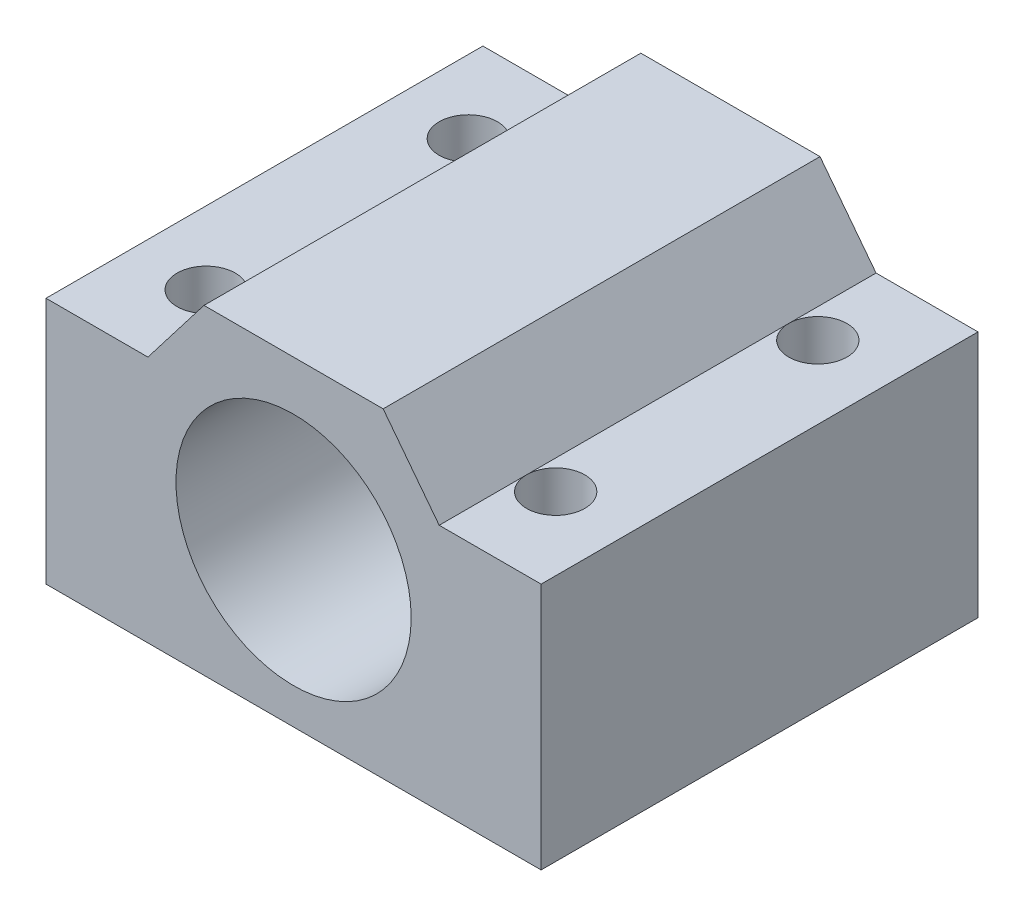
ISO-10303-21;
HEADER;
FILE_DESCRIPTION(('STEP AP214'),'2;1');
FILE_NAME('part.step','',(''),(''),'','','');
FILE_SCHEMA(('AUTOMOTIVE_DESIGN { 1 0 10303 214 1 1 1 1 }'));
ENDSEC;
DATA;
#1=APPLICATION_CONTEXT('core data for automotive mechanical design processes');
#2=APPLICATION_PROTOCOL_DEFINITION('international standard','automotive_design',2000,#1);
#3=PRODUCT_CONTEXT('',#1,'mechanical');
#4=PRODUCT('Part','Part','',(#3));
#5=PRODUCT_RELATED_PRODUCT_CATEGORY('part','',(#4));
#6=PRODUCT_DEFINITION_FORMATION('','',#4);
#7=PRODUCT_DEFINITION_CONTEXT('part definition',#1,'design');
#8=PRODUCT_DEFINITION('design','',#6,#7);
#9=PRODUCT_DEFINITION_SHAPE('','',#8);
#10=(LENGTH_UNIT() NAMED_UNIT(*) SI_UNIT(.MILLI.,.METRE.));
#11=(NAMED_UNIT(*) PLANE_ANGLE_UNIT() SI_UNIT($,.RADIAN.));
#12=(NAMED_UNIT(*) SI_UNIT($,.STERADIAN.) SOLID_ANGLE_UNIT());
#13=UNCERTAINTY_MEASURE_WITH_UNIT(LENGTH_MEASURE(1.E-05),#10,'distance_accuracy_value','');
#14=(GEOMETRIC_REPRESENTATION_CONTEXT(3) GLOBAL_UNCERTAINTY_ASSIGNED_CONTEXT((#13)) GLOBAL_UNIT_ASSIGNED_CONTEXT((#10,
#11,#12)) REPRESENTATION_CONTEXT('',''));
#15=CARTESIAN_POINT('',(0.,0.,0.));
#16=DIRECTION('',(0.,0.,1.));
#17=DIRECTION('',(1.,0.,0.));
#18=AXIS2_PLACEMENT_3D('',#15,#16,#17);
#19=CARTESIAN_POINT('',(0.,17.,0.));
#20=DIRECTION('',(0.,1.,0.));
#21=DIRECTION('',(0.,0.,1.));
#22=AXIS2_PLACEMENT_3D('',#19,#20,#21);
#23=PLANE('',#22);
#24=DIRECTION('',(-1.,0.,0.));
#25=VECTOR('',#24,1.);
#26=CARTESIAN_POINT('',(-15.7742946708464,17.,-17.9561128526646));
#27=LINE('',#26,#25);
#28=CARTESIAN_POINT('',(18.2257053291536,17.,-17.9561128526646));
#29=VERTEX_POINT('',#28);
#30=CARTESIAN_POINT('',(11.2257053291536,17.,-17.9561128526646));
#31=VERTEX_POINT('',#30);
#32=EDGE_CURVE('E195',#29,#31,#27,.T.);
#33=ORIENTED_EDGE('',*,*,#32,.T.);
#34=DIRECTION('',(0.,0.,1.));
#35=VECTOR('',#34,1.);
#36=CARTESIAN_POINT('',(11.2257053291536,17.,-38.5716409807529));
#37=LINE('',#36,#35);
#38=CARTESIAN_POINT('',(11.2257053291536,17.,-11.9561128526646));
#39=VERTEX_POINT('',#38);
#40=EDGE_CURVE('E135',#31,#39,#37,.T.);
#41=ORIENTED_EDGE('',*,*,#40,.T.);
#42=CARTESIAN_POINT('',(13.2257053291536,17.,-11.9561128526646));
#43=DIRECTION('',(0.,1.,0.));
#44=DIRECTION('',(0.,0.,-1.));
#45=AXIS2_PLACEMENT_3D('',#42,#43,#44);
#46=CIRCLE('',#45,2.);
#47=EDGE_CURVE('E178',#39,#39,#46,.T.);
#48=ORIENTED_EDGE('',*,*,#47,.F.);
#49=CARTESIAN_POINT('',(11.2257053291536,17.,6.04388714733542));
#50=VERTEX_POINT('',#49);
#51=EDGE_CURVE('E162',#39,#50,#37,.T.);
#52=ORIENTED_EDGE('',*,*,#51,.T.);
#53=CARTESIAN_POINT('',(13.2257053291536,17.,6.04388714733543));
#54=DIRECTION('',(0.,1.,0.));
#55=DIRECTION('',(0.,0.,1.));
#56=AXIS2_PLACEMENT_3D('',#53,#54,#55);
#57=CIRCLE('',#56,2.);
#58=EDGE_CURVE('E172',#50,#50,#57,.T.);
#59=ORIENTED_EDGE('',*,*,#58,.F.);
#60=CARTESIAN_POINT('',(11.2257053291536,17.,12.0438871473354));
#61=VERTEX_POINT('',#60);
#62=EDGE_CURVE('E163',#50,#61,#37,.T.);
#63=ORIENTED_EDGE('',*,*,#62,.T.);
#64=DIRECTION('',(1.,0.,0.));
#65=VECTOR('',#64,1.);
#66=CARTESIAN_POINT('',(-15.7742946708464,17.,12.0438871473354));
#67=LINE('',#66,#65);
#68=CARTESIAN_POINT('',(18.2257053291536,17.,12.0438871473354));
#69=VERTEX_POINT('',#68);
#70=EDGE_CURVE('E147',#61,#69,#67,.T.);
#71=ORIENTED_EDGE('',*,*,#70,.T.);
#72=DIRECTION('',(0.,0.,-1.));
#73=VECTOR('',#72,1.);
#74=CARTESIAN_POINT('',(18.2257053291536,17.,-17.9561128526646));
#75=LINE('',#74,#73);
#76=EDGE_CURVE('E193',#69,#29,#75,.T.);
#77=ORIENTED_EDGE('',*,*,#76,.T.);
#78=EDGE_LOOP('',(#33,#41,#48,#52,#59,#63,#71,#77));
#79=FACE_BOUND('',#78,.T.);
#80=ADVANCED_FACE('F37',(#79),#23,.T.);
#81=DIRECTION('',(0.,0.,1.));
#82=VECTOR('',#81,1.);
#83=CARTESIAN_POINT('',(-8.7742946708464,17.,-38.5716409807529));
#84=LINE('',#83,#82);
#85=CARTESIAN_POINT('',(-8.77429467084641,17.,-17.9561128526646));
#86=VERTEX_POINT('',#85);
#87=CARTESIAN_POINT('',(-8.7742946708464,17.,-11.9561128526646));
#88=VERTEX_POINT('',#87);
#89=EDGE_CURVE('E48',#86,#88,#84,.T.);
#90=ORIENTED_EDGE('',*,*,#89,.F.);
#91=CARTESIAN_POINT('',(-15.7742946708464,17.,-17.9561128526646));
#92=VERTEX_POINT('',#91);
#93=EDGE_CURVE('E64',#86,#92,#27,.T.);
#94=ORIENTED_EDGE('',*,*,#93,.T.);
#95=DIRECTION('',(0.,0.,1.));
#96=VECTOR('',#95,1.);
#97=CARTESIAN_POINT('',(-15.7742946708464,17.,-17.9561128526646));
#98=LINE('',#97,#96);
#99=CARTESIAN_POINT('',(-15.7742946708464,17.,12.0438871473354));
#100=VERTEX_POINT('',#99);
#101=EDGE_CURVE('E190',#92,#100,#98,.T.);
#102=ORIENTED_EDGE('',*,*,#101,.T.);
#103=CARTESIAN_POINT('',(-8.7742946708464,17.,12.0438871473354));
#104=VERTEX_POINT('',#103);
#105=EDGE_CURVE('E94',#100,#104,#67,.T.);
#106=ORIENTED_EDGE('',*,*,#105,.T.);
#107=CARTESIAN_POINT('',(-8.7742946708464,17.,6.04388714733542));
#108=VERTEX_POINT('',#107);
#109=EDGE_CURVE('E46',#108,#104,#84,.T.);
#110=ORIENTED_EDGE('',*,*,#109,.F.);
#111=CARTESIAN_POINT('',(-10.7742946708464,17.,6.04388714733543));
#112=DIRECTION('',(0.,1.,0.));
#113=DIRECTION('',(0.,0.,-1.));
#114=AXIS2_PLACEMENT_3D('',#111,#112,#113);
#115=CIRCLE('',#114,2.);
#116=EDGE_CURVE('E166',#108,#108,#115,.T.);
#117=ORIENTED_EDGE('',*,*,#116,.F.);
#118=EDGE_CURVE('E11',#88,#108,#84,.T.);
#119=ORIENTED_EDGE('',*,*,#118,.F.);
#120=CARTESIAN_POINT('',(-10.7742946708464,17.,-11.9561128526646));
#121=DIRECTION('',(0.,1.,0.));
#122=DIRECTION('',(0.,0.,1.));
#123=AXIS2_PLACEMENT_3D('',#120,#121,#122);
#124=CIRCLE('',#123,2.);
#125=EDGE_CURVE('E184',#88,#88,#124,.T.);
#126=ORIENTED_EDGE('',*,*,#125,.F.);
#127=EDGE_LOOP('',(#90,#94,#102,#106,#110,#117,#119,#126));
#128=FACE_BOUND('',#127,.T.);
#129=ADVANCED_FACE('F223',(#128),#23,.T.);
#130=CARTESIAN_POINT('',(0.,0.,0.));
#131=DIRECTION('',(0.,1.,0.));
#132=DIRECTION('',(0.,0.,1.));
#133=AXIS2_PLACEMENT_3D('',#130,#131,#132);
#134=PLANE('',#133);
#135=DIRECTION('',(0.,0.,1.));
#136=VECTOR('',#135,1.);
#137=CARTESIAN_POINT('',(-15.7742946708464,0.,-17.9561128526646));
#138=LINE('',#137,#136);
#139=CARTESIAN_POINT('',(-15.7742946708464,0.,-17.9561128526646));
#140=VERTEX_POINT('',#139);
#141=CARTESIAN_POINT('',(-15.7742946708464,0.,12.0438871473354));
#142=VERTEX_POINT('',#141);
#143=EDGE_CURVE('E187',#140,#142,#138,.T.);
#144=ORIENTED_EDGE('',*,*,#143,.F.);
#145=DIRECTION('',(-1.,0.,0.));
#146=VECTOR('',#145,1.);
#147=CARTESIAN_POINT('',(-15.7742946708464,0.,-17.9561128526646));
#148=LINE('',#147,#146);
#149=CARTESIAN_POINT('',(18.2257053291536,0.,-17.9561128526646));
#150=VERTEX_POINT('',#149);
#151=EDGE_CURVE('E86',#150,#140,#148,.T.);
#152=ORIENTED_EDGE('',*,*,#151,.F.);
#153=DIRECTION('',(0.,0.,-1.));
#154=VECTOR('',#153,1.);
#155=CARTESIAN_POINT('',(18.2257053291536,0.,-17.9561128526646));
#156=LINE('',#155,#154);
#157=CARTESIAN_POINT('',(18.2257053291536,0.,12.0438871473354));
#158=VERTEX_POINT('',#157);
#159=EDGE_CURVE('E203',#158,#150,#156,.T.);
#160=ORIENTED_EDGE('',*,*,#159,.F.);
#161=DIRECTION('',(1.,0.,0.));
#162=VECTOR('',#161,1.);
#163=CARTESIAN_POINT('',(-15.7742946708464,0.,12.0438871473354));
#164=LINE('',#163,#162);
#165=EDGE_CURVE('E201',#142,#158,#164,.T.);
#166=ORIENTED_EDGE('',*,*,#165,.F.);
#167=EDGE_LOOP('',(#144,#152,#160,#166));
#168=FACE_BOUND('',#167,.T.);
#169=CARTESIAN_POINT('',(-10.7742946708464,0.,-11.9561128526646));
#170=DIRECTION('',(0.,1.,0.));
#171=DIRECTION('',(0.,0.,1.));
#172=AXIS2_PLACEMENT_3D('',#169,#170,#171);
#173=CIRCLE('',#172,2.);
#174=CARTESIAN_POINT('',(-10.7742946708464,0.,-9.95611285266457));
#175=VERTEX_POINT('',#174);
#176=EDGE_CURVE('E181',#175,#175,#173,.T.);
#177=ORIENTED_EDGE('',*,*,#176,.T.);
#178=EDGE_LOOP('',(#177));
#179=FACE_BOUND('',#178,.T.);
#180=CARTESIAN_POINT('',(13.2257053291536,0.,-11.9561128526646));
#181=DIRECTION('',(0.,1.,0.));
#182=DIRECTION('',(0.,0.,-1.));
#183=AXIS2_PLACEMENT_3D('',#180,#181,#182);
#184=CIRCLE('',#183,2.);
#185=CARTESIAN_POINT('',(13.2257053291536,0.,-13.9561128526646));
#186=VERTEX_POINT('',#185);
#187=EDGE_CURVE('E175',#186,#186,#184,.T.);
#188=ORIENTED_EDGE('',*,*,#187,.T.);
#189=EDGE_LOOP('',(#188));
#190=FACE_BOUND('',#189,.T.);
#191=CARTESIAN_POINT('',(13.2257053291536,0.,6.04388714733543));
#192=DIRECTION('',(0.,1.,0.));
#193=DIRECTION('',(0.,0.,1.));
#194=AXIS2_PLACEMENT_3D('',#191,#192,#193);
#195=CIRCLE('',#194,2.);
#196=CARTESIAN_POINT('',(13.2257053291536,0.,8.04388714733543));
#197=VERTEX_POINT('',#196);
#198=EDGE_CURVE('E169',#197,#197,#195,.T.);
#199=ORIENTED_EDGE('',*,*,#198,.T.);
#200=EDGE_LOOP('',(#199));
#201=FACE_BOUND('',#200,.T.);
#202=CARTESIAN_POINT('',(-10.7742946708464,0.,6.04388714733543));
#203=DIRECTION('',(0.,1.,0.));
#204=DIRECTION('',(0.,0.,-1.));
#205=AXIS2_PLACEMENT_3D('',#202,#203,#204);
#206=CIRCLE('',#205,2.);
#207=CARTESIAN_POINT('',(-10.7742946708464,0.,4.04388714733543));
#208=VERTEX_POINT('',#207);
#209=EDGE_CURVE('E165',#208,#208,#206,.T.);
#210=ORIENTED_EDGE('',*,*,#209,.T.);
#211=EDGE_LOOP('',(#210));
#212=FACE_BOUND('',#211,.T.);
#213=ADVANCED_FACE('F228',(#168,#179,#190,#201,#212),#134,.F.);
#214=CARTESIAN_POINT('',(-15.7742946708464,17.,-17.9561128526646));
#215=DIRECTION('',(1.,0.,0.));
#216=DIRECTION('',(0.,0.,-1.));
#217=AXIS2_PLACEMENT_3D('',#214,#215,#216);
#218=PLANE('',#217);
#219=ORIENTED_EDGE('',*,*,#143,.T.);
#220=DIRECTION('',(0.,-1.,0.));
#221=VECTOR('',#220,1.);
#222=CARTESIAN_POINT('',(-15.7742946708464,17.,12.0438871473354));
#223=LINE('',#222,#221);
#224=EDGE_CURVE('E41',#100,#142,#223,.T.);
#225=ORIENTED_EDGE('',*,*,#224,.F.);
#226=ORIENTED_EDGE('',*,*,#101,.F.);
#227=DIRECTION('',(0.,-1.,0.));
#228=VECTOR('',#227,1.);
#229=CARTESIAN_POINT('',(-15.7742946708464,17.,-17.9561128526646));
#230=LINE('',#229,#228);
#231=EDGE_CURVE('E198',#92,#140,#230,.T.);
#232=ORIENTED_EDGE('',*,*,#231,.T.);
#233=EDGE_LOOP('',(#219,#225,#226,#232));
#234=FACE_BOUND('',#233,.T.);
#235=ADVANCED_FACE('F39',(#234),#218,.F.);
#236=CARTESIAN_POINT('',(-15.7742946708464,17.,12.0438871473354));
#237=DIRECTION('',(0.,0.,-1.));
#238=DIRECTION('',(-1.,0.,0.));
#239=AXIS2_PLACEMENT_3D('',#236,#237,#238);
#240=PLANE('',#239);
#241=CARTESIAN_POINT('',(1.22570532915359,10.534716584043,12.0438871473354));
#242=DIRECTION('',(0.,0.,1.));
#243=DIRECTION('',(1.,0.,0.));
#244=AXIS2_PLACEMENT_3D('',#241,#242,#243);
#245=CIRCLE('',#244,8.07551033040824);
#246=CARTESIAN_POINT('',(9.30121565956183,10.534716584043,12.0438871473354));
#247=VERTEX_POINT('',#246);
#248=EDGE_CURVE('E151',#247,#247,#245,.T.);
#249=ORIENTED_EDGE('',*,*,#248,.F.);
#250=EDGE_LOOP('',(#249));
#251=FACE_BOUND('',#250,.T.);
#252=ORIENTED_EDGE('',*,*,#165,.T.);
#253=DIRECTION('',(0.,-1.,0.));
#254=VECTOR('',#253,1.);
#255=CARTESIAN_POINT('',(18.2257053291536,17.,12.0438871473354));
#256=LINE('',#255,#254);
#257=EDGE_CURVE('E208',#69,#158,#256,.T.);
#258=ORIENTED_EDGE('',*,*,#257,.F.);
#259=ORIENTED_EDGE('',*,*,#70,.F.);
#260=DIRECTION('',(-0.609888573883195,0.792487178096102,0.));
#261=VECTOR('',#260,1.);
#262=CARTESIAN_POINT('',(15.2667371304243,11.7490967597649,12.0438871473354));
#263=LINE('',#262,#261);
#264=CARTESIAN_POINT('',(7.37776563536315,22.,12.0438871473354));
#265=VERTEX_POINT('',#264);
#266=EDGE_CURVE('E55',#61,#265,#263,.T.);
#267=ORIENTED_EDGE('',*,*,#266,.T.);
#268=DIRECTION('',(1.,0.,0.));
#269=VECTOR('',#268,1.);
#270=CARTESIAN_POINT('',(0.,22.,12.0438871473354));
#271=LINE('',#270,#269);
#272=CARTESIAN_POINT('',(-4.92635497705596,22.,12.0438871473354));
#273=VERTEX_POINT('',#272);
#274=EDGE_CURVE('E138',#273,#265,#271,.T.);
#275=ORIENTED_EDGE('',*,*,#274,.F.);
#276=DIRECTION('',(0.609888573883195,0.792487178096102,0.));
#277=VECTOR('',#276,1.);
#278=CARTESIAN_POINT('',(-13.7271631640816,10.5642592044415,12.0438871473354));
#279=LINE('',#278,#277);
#280=EDGE_CURVE('E142',#104,#273,#279,.T.);
#281=ORIENTED_EDGE('',*,*,#280,.F.);
#282=ORIENTED_EDGE('',*,*,#105,.F.);
#283=ORIENTED_EDGE('',*,*,#224,.T.);
#284=EDGE_LOOP('',(#252,#258,#259,#267,#275,#281,#282,#283));
#285=FACE_BOUND('',#284,.T.);
#286=ADVANCED_FACE('F145',(#251,#285),#240,.F.);
#287=CARTESIAN_POINT('',(18.2257053291536,17.,-17.9561128526646));
#288=DIRECTION('',(-1.,0.,0.));
#289=DIRECTION('',(0.,0.,1.));
#290=AXIS2_PLACEMENT_3D('',#287,#288,#289);
#291=PLANE('',#290);
#292=ORIENTED_EDGE('',*,*,#159,.T.);
#293=DIRECTION('',(0.,-1.,0.));
#294=VECTOR('',#293,1.);
#295=CARTESIAN_POINT('',(18.2257053291536,17.,-17.9561128526646));
#296=LINE('',#295,#294);
#297=EDGE_CURVE('E207',#29,#150,#296,.T.);
#298=ORIENTED_EDGE('',*,*,#297,.F.);
#299=ORIENTED_EDGE('',*,*,#76,.F.);
#300=ORIENTED_EDGE('',*,*,#257,.T.);
#301=EDGE_LOOP('',(#292,#298,#299,#300));
#302=FACE_BOUND('',#301,.T.);
#303=ADVANCED_FACE('F231',(#302),#291,.F.);
#304=CARTESIAN_POINT('',(-15.7742946708464,17.,-17.9561128526646));
#305=DIRECTION('',(0.,0.,1.));
#306=DIRECTION('',(1.,0.,0.));
#307=AXIS2_PLACEMENT_3D('',#304,#305,#306);
#308=PLANE('',#307);
#309=CARTESIAN_POINT('',(1.22570532915359,10.534716584043,-17.9561128526646));
#310=DIRECTION('',(0.,0.,1.));
#311=DIRECTION('',(1.,0.,0.));
#312=AXIS2_PLACEMENT_3D('',#309,#310,#311);
#313=CIRCLE('',#312,8.07551033040824);
#314=CARTESIAN_POINT('',(9.30121565956183,10.534716584043,-17.9561128526646));
#315=VERTEX_POINT('',#314);
#316=EDGE_CURVE('E148',#315,#315,#313,.F.);
#317=ORIENTED_EDGE('',*,*,#316,.F.);
#318=EDGE_LOOP('',(#317));
#319=FACE_BOUND('',#318,.T.);
#320=ORIENTED_EDGE('',*,*,#151,.T.);
#321=ORIENTED_EDGE('',*,*,#231,.F.);
#322=ORIENTED_EDGE('',*,*,#93,.F.);
#323=DIRECTION('',(-0.609888573883195,-0.792487178096102,0.));
#324=VECTOR('',#323,1.);
#325=CARTESIAN_POINT('',(-13.7271631640816,10.5642592044415,-17.9561128526646));
#326=LINE('',#325,#324);
#327=CARTESIAN_POINT('',(-4.92635497705596,22.,-17.9561128526646));
#328=VERTEX_POINT('',#327);
#329=EDGE_CURVE('E154',#328,#86,#326,.T.);
#330=ORIENTED_EDGE('',*,*,#329,.F.);
#331=DIRECTION('',(-1.,0.,0.));
#332=VECTOR('',#331,1.);
#333=CARTESIAN_POINT('',(0.,22.,-17.9561128526646));
#334=LINE('',#333,#332);
#335=CARTESIAN_POINT('',(7.37776563536315,22.,-17.9561128526646));
#336=VERTEX_POINT('',#335);
#337=EDGE_CURVE('E158',#336,#328,#334,.T.);
#338=ORIENTED_EDGE('',*,*,#337,.F.);
#339=DIRECTION('',(0.609888573883195,-0.792487178096102,0.));
#340=VECTOR('',#339,1.);
#341=CARTESIAN_POINT('',(15.2667371304243,11.7490967597649,-17.9561128526646));
#342=LINE('',#341,#340);
#343=EDGE_CURVE('E131',#336,#31,#342,.T.);
#344=ORIENTED_EDGE('',*,*,#343,.T.);
#345=ORIENTED_EDGE('',*,*,#32,.F.);
#346=ORIENTED_EDGE('',*,*,#297,.T.);
#347=EDGE_LOOP('',(#320,#321,#322,#330,#338,#344,#345,#346));
#348=FACE_BOUND('',#347,.T.);
#349=ADVANCED_FACE('F233',(#319,#348),#308,.F.);
#350=CARTESIAN_POINT('',(-10.7742946708464,17.,-11.9561128526646));
#351=DIRECTION('',(0.,-1.,0.));
#352=DIRECTION('',(0.,0.,-1.));
#353=AXIS2_PLACEMENT_3D('',#350,#351,#352);
#354=CYLINDRICAL_SURFACE('',#353,2.);
#355=ORIENTED_EDGE('',*,*,#125,.T.);
#356=EDGE_LOOP('',(#355));
#357=FACE_BOUND('',#356,.T.);
#358=ORIENTED_EDGE('',*,*,#176,.F.);
#359=EDGE_LOOP('',(#358));
#360=FACE_BOUND('',#359,.T.);
#361=ADVANCED_FACE('F253',(#357,#360),#354,.F.);
#362=CARTESIAN_POINT('',(13.2257053291536,17.,-11.9561128526646));
#363=DIRECTION('',(0.,-1.,0.));
#364=DIRECTION('',(0.,0.,-1.));
#365=AXIS2_PLACEMENT_3D('',#362,#363,#364);
#366=CYLINDRICAL_SURFACE('',#365,2.);
#367=ORIENTED_EDGE('',*,*,#47,.T.);
#368=EDGE_LOOP('',(#367));
#369=FACE_BOUND('',#368,.T.);
#370=ORIENTED_EDGE('',*,*,#187,.F.);
#371=EDGE_LOOP('',(#370));
#372=FACE_BOUND('',#371,.T.);
#373=ADVANCED_FACE('F262',(#369,#372),#366,.F.);
#374=CARTESIAN_POINT('',(13.2257053291536,17.,6.04388714733543));
#375=DIRECTION('',(0.,-1.,0.));
#376=DIRECTION('',(0.,0.,-1.));
#377=AXIS2_PLACEMENT_3D('',#374,#375,#376);
#378=CYLINDRICAL_SURFACE('',#377,2.);
#379=ORIENTED_EDGE('',*,*,#58,.T.);
#380=EDGE_LOOP('',(#379));
#381=FACE_BOUND('',#380,.T.);
#382=ORIENTED_EDGE('',*,*,#198,.F.);
#383=EDGE_LOOP('',(#382));
#384=FACE_BOUND('',#383,.T.);
#385=ADVANCED_FACE('F280',(#381,#384),#378,.F.);
#386=CARTESIAN_POINT('',(-10.7742946708464,17.,6.04388714733543));
#387=DIRECTION('',(0.,-1.,0.));
#388=DIRECTION('',(0.,0.,-1.));
#389=AXIS2_PLACEMENT_3D('',#386,#387,#388);
#390=CYLINDRICAL_SURFACE('',#389,2.);
#391=ORIENTED_EDGE('',*,*,#116,.T.);
#392=EDGE_LOOP('',(#391));
#393=FACE_BOUND('',#392,.T.);
#394=ORIENTED_EDGE('',*,*,#209,.F.);
#395=EDGE_LOOP('',(#394));
#396=FACE_BOUND('',#395,.T.);
#397=ADVANCED_FACE('F275',(#393,#396),#390,.F.);
#398=CARTESIAN_POINT('',(-13.7271631640816,10.5642592044415,-38.5716409807529));
#399=DIRECTION('',(0.792487178096102,-0.609888573883195,0.));
#400=DIRECTION('',(0.609888573883195,0.792487178096102,0.));
#401=AXIS2_PLACEMENT_3D('',#398,#399,#400);
#402=PLANE('',#401);
#403=DIRECTION('',(0.,0.,1.));
#404=VECTOR('',#403,1.);
#405=CARTESIAN_POINT('',(-4.92635497705596,22.,-38.5716409807529));
#406=LINE('',#405,#404);
#407=EDGE_CURVE('E134',#328,#273,#406,.T.);
#408=ORIENTED_EDGE('',*,*,#407,.F.);
#409=ORIENTED_EDGE('',*,*,#329,.T.);
#410=ORIENTED_EDGE('',*,*,#89,.T.);
#411=ORIENTED_EDGE('',*,*,#118,.T.);
#412=ORIENTED_EDGE('',*,*,#109,.T.);
#413=ORIENTED_EDGE('',*,*,#280,.T.);
#414=EDGE_LOOP('',(#408,#409,#410,#411,#412,#413));
#415=FACE_BOUND('',#414,.T.);
#416=ADVANCED_FACE('F220',(#415),#402,.F.);
#417=CARTESIAN_POINT('',(0.,22.,-38.5716409807529));
#418=DIRECTION('',(0.,-1.,0.));
#419=DIRECTION('',(0.,0.,-1.));
#420=AXIS2_PLACEMENT_3D('',#417,#418,#419);
#421=PLANE('',#420);
#422=DIRECTION('',(0.,0.,1.));
#423=VECTOR('',#422,1.);
#424=CARTESIAN_POINT('',(7.37776563536315,22.,-38.5716409807529));
#425=LINE('',#424,#423);
#426=EDGE_CURVE('E127',#336,#265,#425,.T.);
#427=ORIENTED_EDGE('',*,*,#426,.F.);
#428=ORIENTED_EDGE('',*,*,#337,.T.);
#429=ORIENTED_EDGE('',*,*,#407,.T.);
#430=ORIENTED_EDGE('',*,*,#274,.T.);
#431=EDGE_LOOP('',(#427,#428,#429,#430));
#432=FACE_BOUND('',#431,.T.);
#433=ADVANCED_FACE('F139',(#432),#421,.F.);
#434=CARTESIAN_POINT('',(15.2667371304243,11.7490967597649,-38.5716409807529));
#435=DIRECTION('',(0.792487178096102,0.609888573883195,0.));
#436=DIRECTION('',(-0.609888573883195,0.792487178096102,0.));
#437=AXIS2_PLACEMENT_3D('',#434,#435,#436);
#438=PLANE('',#437);
#439=ORIENTED_EDGE('',*,*,#343,.F.);
#440=ORIENTED_EDGE('',*,*,#426,.T.);
#441=ORIENTED_EDGE('',*,*,#266,.F.);
#442=ORIENTED_EDGE('',*,*,#62,.F.);
#443=ORIENTED_EDGE('',*,*,#51,.F.);
#444=ORIENTED_EDGE('',*,*,#40,.F.);
#445=EDGE_LOOP('',(#439,#440,#441,#442,#443,#444));
#446=FACE_BOUND('',#445,.T.);
#447=ADVANCED_FACE('F129',(#446),#438,.T.);
#448=CARTESIAN_POINT('',(1.22570532915359,10.534716584043,-40.7971053173593));
#449=DIRECTION('',(0.,0.,1.));
#450=DIRECTION('',(1.,0.,0.));
#451=AXIS2_PLACEMENT_3D('',#448,#449,#450);
#452=CYLINDRICAL_SURFACE('',#451,8.07551033040824);
#453=ORIENTED_EDGE('',*,*,#316,.T.);
#454=EDGE_LOOP('',(#453));
#455=FACE_BOUND('',#454,.T.);
#456=ORIENTED_EDGE('',*,*,#248,.T.);
#457=EDGE_LOOP('',(#456));
#458=FACE_BOUND('',#457,.T.);
#459=ADVANCED_FACE('F238',(#455,#458),#452,.F.);
#460=CLOSED_SHELL('',(#80,#129,#213,#235,#286,#303,#349,#361,#373,#385,#397,#416,#433,#447,#459));
#461=MANIFOLD_SOLID_BREP('B2',#460);
#462=ADVANCED_BREP_SHAPE_REPRESENTATION('',(#18,#461),#14);
#463=SHAPE_DEFINITION_REPRESENTATION(#9,#462);
ENDSEC;
END-ISO-10303-21;
